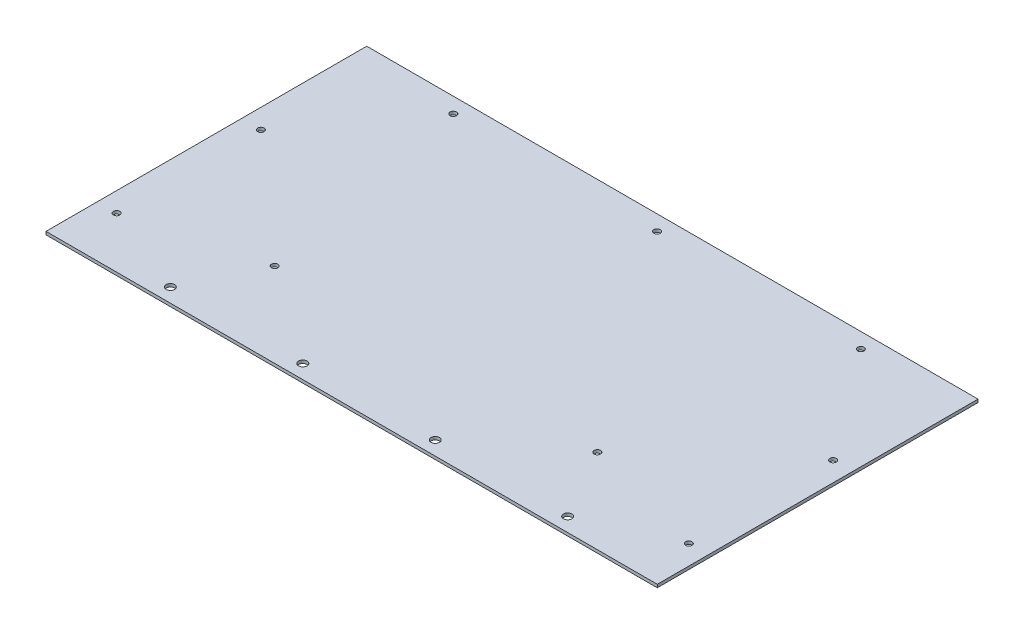
ISO-10303-21;
HEADER;
FILE_DESCRIPTION(('STEP AP214'),'2;1');
FILE_NAME('part.step','',(''),(''),'','','');
FILE_SCHEMA(('AUTOMOTIVE_DESIGN { 1 0 10303 214 1 1 1 1 }'));
ENDSEC;
DATA;
#1=APPLICATION_CONTEXT('core data for automotive mechanical design processes');
#2=APPLICATION_PROTOCOL_DEFINITION('international standard','automotive_design',2000,#1);
#3=PRODUCT_CONTEXT('',#1,'mechanical');
#4=PRODUCT('Part','Part','',(#3));
#5=PRODUCT_RELATED_PRODUCT_CATEGORY('part','',(#4));
#6=PRODUCT_DEFINITION_FORMATION('','',#4);
#7=PRODUCT_DEFINITION_CONTEXT('part definition',#1,'design');
#8=PRODUCT_DEFINITION('design','',#6,#7);
#9=PRODUCT_DEFINITION_SHAPE('','',#8);
#10=(LENGTH_UNIT() NAMED_UNIT(*) SI_UNIT(.MILLI.,.METRE.));
#11=(NAMED_UNIT(*) PLANE_ANGLE_UNIT() SI_UNIT($,.RADIAN.));
#12=(NAMED_UNIT(*) SI_UNIT($,.STERADIAN.) SOLID_ANGLE_UNIT());
#13=UNCERTAINTY_MEASURE_WITH_UNIT(LENGTH_MEASURE(1.E-05),#10,'distance_accuracy_value','');
#14=(GEOMETRIC_REPRESENTATION_CONTEXT(3) GLOBAL_UNCERTAINTY_ASSIGNED_CONTEXT((#13)) GLOBAL_UNIT_ASSIGNED_CONTEXT((#10,
#11,#12)) REPRESENTATION_CONTEXT('',''));
#15=CARTESIAN_POINT('',(0.,0.,0.));
#16=DIRECTION('',(0.,0.,1.));
#17=DIRECTION('',(1.,0.,0.));
#18=AXIS2_PLACEMENT_3D('',#15,#16,#17);
#19=CARTESIAN_POINT('',(151.1185,-1.397,229.425200026));
#20=DIRECTION('',(0.,1.,0.));
#21=DIRECTION('',(0.,0.,1.));
#22=AXIS2_PLACEMENT_3D('',#19,#20,#21);
#23=CYLINDRICAL_SURFACE('',#22,3.175);
#24=CARTESIAN_POINT('',(151.1185,1.143,229.425200026));
#25=DIRECTION('',(0.,1.,0.));
#26=DIRECTION('',(0.,0.,1.));
#27=AXIS2_PLACEMENT_3D('',#24,#25,#26);
#28=CIRCLE('',#27,3.175);
#29=CARTESIAN_POINT('',(151.1185,1.143,232.600200026));
#30=VERTEX_POINT('',#29);
#31=EDGE_CURVE('E46',#30,#30,#28,.T.);
#32=ORIENTED_EDGE('',*,*,#31,.T.);
#33=EDGE_LOOP('',(#32));
#34=FACE_BOUND('',#33,.T.);
#35=CARTESIAN_POINT('',(151.1185,-1.143,229.425200026));
#36=DIRECTION('',(0.,1.,0.));
#37=DIRECTION('',(0.,0.,1.));
#38=AXIS2_PLACEMENT_3D('',#35,#36,#37);
#39=CIRCLE('',#38,3.175);
#40=CARTESIAN_POINT('',(151.1185,-1.143,232.600200026));
#41=VERTEX_POINT('',#40);
#42=EDGE_CURVE('E11',#41,#41,#39,.T.);
#43=ORIENTED_EDGE('',*,*,#42,.F.);
#44=EDGE_LOOP('',(#43));
#45=FACE_BOUND('',#44,.T.);
#46=ADVANCED_FACE('F39',(#34,#45),#23,.F.);
#47=CARTESIAN_POINT('',(52.0585,-1.397,229.425200026));
#48=DIRECTION('',(0.,1.,0.));
#49=DIRECTION('',(0.,0.,1.));
#50=AXIS2_PLACEMENT_3D('',#47,#48,#49);
#51=CYLINDRICAL_SURFACE('',#50,3.175);
#52=CARTESIAN_POINT('',(52.0585,1.143,229.425200026));
#53=DIRECTION('',(0.,1.,0.));
#54=DIRECTION('',(0.,0.,1.));
#55=AXIS2_PLACEMENT_3D('',#52,#53,#54);
#56=CIRCLE('',#55,3.175);
#57=CARTESIAN_POINT('',(52.0585,1.143,232.600200026));
#58=VERTEX_POINT('',#57);
#59=EDGE_CURVE('E132',#58,#58,#56,.T.);
#60=ORIENTED_EDGE('',*,*,#59,.T.);
#61=EDGE_LOOP('',(#60));
#62=FACE_BOUND('',#61,.T.);
#63=CARTESIAN_POINT('',(52.0585,-1.143,229.425200026));
#64=DIRECTION('',(0.,1.,0.));
#65=DIRECTION('',(0.,0.,1.));
#66=AXIS2_PLACEMENT_3D('',#63,#64,#65);
#67=CIRCLE('',#66,3.175);
#68=CARTESIAN_POINT('',(52.0585,-1.143,232.600200026));
#69=VERTEX_POINT('',#68);
#70=EDGE_CURVE('E137',#69,#69,#67,.T.);
#71=ORIENTED_EDGE('',*,*,#70,.F.);
#72=EDGE_LOOP('',(#71));
#73=FACE_BOUND('',#72,.T.);
#74=ADVANCED_FACE('F156',(#62,#73),#51,.F.);
#75=CARTESIAN_POINT('',(228.6115,-1.143,238.315200026));
#76=DIRECTION('',(-1.,0.,0.));
#77=DIRECTION('',(0.,0.,1.));
#78=AXIS2_PLACEMENT_3D('',#75,#76,#77);
#79=PLANE('',#78);
#80=DIRECTION('',(0.,1.,0.));
#81=VECTOR('',#80,1.);
#82=CARTESIAN_POINT('',(228.6115,-1.143,0.));
#83=LINE('',#82,#81);
#84=CARTESIAN_POINT('',(228.6115,-1.143,0.));
#85=VERTEX_POINT('',#84);
#86=CARTESIAN_POINT('',(228.6115,1.143,0.));
#87=VERTEX_POINT('',#86);
#88=EDGE_CURVE('E122',#85,#87,#83,.T.);
#89=ORIENTED_EDGE('',*,*,#88,.T.);
#90=DIRECTION('',(0.,0.,-1.));
#91=VECTOR('',#90,1.);
#92=CARTESIAN_POINT('',(228.6115,1.143,238.315200026));
#93=LINE('',#92,#91);
#94=CARTESIAN_POINT('',(228.6115,1.143,239.902700026));
#95=VERTEX_POINT('',#94);
#96=EDGE_CURVE('E93',#95,#87,#93,.T.);
#97=ORIENTED_EDGE('',*,*,#96,.F.);
#98=DIRECTION('',(0.,1.,0.));
#99=VECTOR('',#98,1.);
#100=CARTESIAN_POINT('',(228.6115,-1.143,239.902700026));
#101=LINE('',#100,#99);
#102=CARTESIAN_POINT('',(228.6115,-1.143,239.902700026));
#103=VERTEX_POINT('',#102);
#104=EDGE_CURVE('E90',#103,#95,#101,.T.);
#105=ORIENTED_EDGE('',*,*,#104,.F.);
#106=DIRECTION('',(0.,0.,-1.));
#107=VECTOR('',#106,1.);
#108=CARTESIAN_POINT('',(228.6115,-1.143,238.315200026));
#109=LINE('',#108,#107);
#110=EDGE_CURVE('E78',#103,#85,#109,.T.);
#111=ORIENTED_EDGE('',*,*,#110,.T.);
#112=EDGE_LOOP('',(#89,#97,#105,#111));
#113=FACE_BOUND('',#112,.T.);
#114=ADVANCED_FACE('F91',(#113),#79,.F.);
#115=CARTESIAN_POINT('',(-228.6115,1.143,238.315200026));
#116=DIRECTION('',(0.,-1.,0.));
#117=DIRECTION('',(0.,0.,-1.));
#118=AXIS2_PLACEMENT_3D('',#115,#116,#117);
#119=PLANE('',#118);
#120=CARTESIAN_POINT('',(-214.0065,1.143,201.724823778392));
#121=DIRECTION('',(0.,-1.,0.));
#122=DIRECTION('',(0.,0.,-1.));
#123=AXIS2_PLACEMENT_3D('',#120,#121,#122);
#124=CIRCLE('',#123,2.39999999999999);
#125=CARTESIAN_POINT('',(-214.0065,1.143,199.324823778392));
#126=VERTEX_POINT('',#125);
#127=EDGE_CURVE('E231',#126,#126,#124,.T.);
#128=ORIENTED_EDGE('',*,*,#127,.T.);
#129=EDGE_LOOP('',(#128));
#130=FACE_BOUND('',#129,.T.);
#131=CARTESIAN_POINT('',(-214.0065,1.143,93.7748237783918));
#132=DIRECTION('',(0.,-1.,0.));
#133=DIRECTION('',(0.,0.,-1.));
#134=AXIS2_PLACEMENT_3D('',#131,#132,#133);
#135=CIRCLE('',#134,2.39999999999999);
#136=CARTESIAN_POINT('',(-214.0065,1.143,91.3748237783918));
#137=VERTEX_POINT('',#136);
#138=EDGE_CURVE('E240',#137,#137,#135,.T.);
#139=ORIENTED_EDGE('',*,*,#138,.T.);
#140=EDGE_LOOP('',(#139));
#141=FACE_BOUND('',#140,.T.);
#142=CARTESIAN_POINT('',(-152.399999999999,1.143,11.43));
#143=DIRECTION('',(0.,-1.,0.));
#144=DIRECTION('',(0.,0.,-1.));
#145=AXIS2_PLACEMENT_3D('',#142,#143,#144);
#146=CIRCLE('',#145,2.39999999999999);
#147=CARTESIAN_POINT('',(-152.399999999999,1.143,9.03000000000002));
#148=VERTEX_POINT('',#147);
#149=EDGE_CURVE('E246',#148,#148,#146,.T.);
#150=ORIENTED_EDGE('',*,*,#149,.T.);
#151=EDGE_LOOP('',(#150));
#152=FACE_BOUND('',#151,.T.);
#153=CARTESIAN_POINT('',(1.45784238087221E-12,1.143,11.43));
#154=DIRECTION('',(0.,-1.,0.));
#155=DIRECTION('',(0.,0.,-1.));
#156=AXIS2_PLACEMENT_3D('',#153,#154,#155);
#157=CIRCLE('',#156,2.39999999999999);
#158=CARTESIAN_POINT('',(1.45784238087221E-12,1.143,9.03000000000001));
#159=VERTEX_POINT('',#158);
#160=EDGE_CURVE('E252',#159,#159,#157,.T.);
#161=ORIENTED_EDGE('',*,*,#160,.T.);
#162=EDGE_LOOP('',(#161));
#163=FACE_BOUND('',#162,.T.);
#164=CARTESIAN_POINT('',(152.400000000001,1.143,11.43));
#165=DIRECTION('',(0.,-1.,0.));
#166=DIRECTION('',(0.,0.,-1.));
#167=AXIS2_PLACEMENT_3D('',#164,#165,#166);
#168=CIRCLE('',#167,2.39999999999999);
#169=CARTESIAN_POINT('',(152.400000000001,1.143,9.03000000000002));
#170=VERTEX_POINT('',#169);
#171=EDGE_CURVE('E258',#170,#170,#168,.T.);
#172=ORIENTED_EDGE('',*,*,#171,.T.);
#173=EDGE_LOOP('',(#172));
#174=FACE_BOUND('',#173,.T.);
#175=CARTESIAN_POINT('',(214.0065,1.143,93.7748237783918));
#176=DIRECTION('',(0.,-1.,0.));
#177=DIRECTION('',(0.,0.,-1.));
#178=AXIS2_PLACEMENT_3D('',#175,#176,#177);
#179=CIRCLE('',#178,2.39999999999999);
#180=CARTESIAN_POINT('',(214.0065,1.143,91.3748237783918));
#181=VERTEX_POINT('',#180);
#182=EDGE_CURVE('E264',#181,#181,#179,.T.);
#183=ORIENTED_EDGE('',*,*,#182,.T.);
#184=EDGE_LOOP('',(#183));
#185=FACE_BOUND('',#184,.T.);
#186=CARTESIAN_POINT('',(214.0065,1.143,201.724823778392));
#187=DIRECTION('',(0.,-1.,0.));
#188=DIRECTION('',(0.,0.,-1.));
#189=AXIS2_PLACEMENT_3D('',#186,#187,#188);
#190=CIRCLE('',#189,2.39999999999999);
#191=CARTESIAN_POINT('',(214.0065,1.143,199.324823778392));
#192=VERTEX_POINT('',#191);
#193=EDGE_CURVE('E270',#192,#192,#190,.T.);
#194=ORIENTED_EDGE('',*,*,#193,.T.);
#195=EDGE_LOOP('',(#194));
#196=FACE_BOUND('',#195,.T.);
#197=CARTESIAN_POINT('',(120.65,1.143,176.776));
#198=DIRECTION('',(0.,-1.,0.));
#199=DIRECTION('',(0.,0.,-1.));
#200=AXIS2_PLACEMENT_3D('',#197,#198,#199);
#201=CIRCLE('',#200,2.4);
#202=CARTESIAN_POINT('',(120.65,1.143,174.376));
#203=VERTEX_POINT('',#202);
#204=EDGE_CURVE('E276',#203,#203,#201,.T.);
#205=ORIENTED_EDGE('',*,*,#204,.T.);
#206=EDGE_LOOP('',(#205));
#207=FACE_BOUND('',#206,.T.);
#208=CARTESIAN_POINT('',(-120.65,1.143,176.776));
#209=DIRECTION('',(0.,-1.,0.));
#210=DIRECTION('',(0.,0.,-1.));
#211=AXIS2_PLACEMENT_3D('',#208,#209,#210);
#212=CIRCLE('',#211,2.4);
#213=CARTESIAN_POINT('',(-120.65,1.143,174.376));
#214=VERTEX_POINT('',#213);
#215=EDGE_CURVE('E103',#214,#214,#212,.T.);
#216=ORIENTED_EDGE('',*,*,#215,.T.);
#217=EDGE_LOOP('',(#216));
#218=FACE_BOUND('',#217,.T.);
#219=CARTESIAN_POINT('',(-47.0015,1.143,229.425200026));
#220=DIRECTION('',(0.,1.,0.));
#221=DIRECTION('',(0.,0.,1.));
#222=AXIS2_PLACEMENT_3D('',#219,#220,#221);
#223=CIRCLE('',#222,3.175);
#224=CARTESIAN_POINT('',(-47.0015,1.143,232.600200026));
#225=VERTEX_POINT('',#224);
#226=EDGE_CURVE('E112',#225,#225,#223,.T.);
#227=ORIENTED_EDGE('',*,*,#226,.F.);
#228=EDGE_LOOP('',(#227));
#229=FACE_BOUND('',#228,.T.);
#230=CARTESIAN_POINT('',(-146.0615,1.143,229.425200026));
#231=DIRECTION('',(0.,1.,0.));
#232=DIRECTION('',(0.,0.,1.));
#233=AXIS2_PLACEMENT_3D('',#230,#231,#232);
#234=CIRCLE('',#233,3.175);
#235=CARTESIAN_POINT('',(-146.0615,1.143,232.600200026));
#236=VERTEX_POINT('',#235);
#237=EDGE_CURVE('E118',#236,#236,#234,.T.);
#238=ORIENTED_EDGE('',*,*,#237,.F.);
#239=EDGE_LOOP('',(#238));
#240=FACE_BOUND('',#239,.T.);
#241=DIRECTION('',(-1.,0.,0.));
#242=VECTOR('',#241,1.);
#243=CARTESIAN_POINT('',(-228.6115,1.143,0.));
#244=LINE('',#243,#242);
#245=CARTESIAN_POINT('',(-228.6115,1.143,0.));
#246=VERTEX_POINT('',#245);
#247=EDGE_CURVE('E124',#87,#246,#244,.T.);
#248=ORIENTED_EDGE('',*,*,#247,.T.);
#249=DIRECTION('',(0.,0.,-1.));
#250=VECTOR('',#249,1.);
#251=CARTESIAN_POINT('',(-228.6115,1.143,238.315200026));
#252=LINE('',#251,#250);
#253=CARTESIAN_POINT('',(-228.6115,1.143,239.902700026));
#254=VERTEX_POINT('',#253);
#255=EDGE_CURVE('E129',#254,#246,#252,.T.);
#256=ORIENTED_EDGE('',*,*,#255,.F.);
#257=DIRECTION('',(-1.,0.,0.));
#258=VECTOR('',#257,1.);
#259=CARTESIAN_POINT('',(228.6115,1.143,239.902700026));
#260=LINE('',#259,#258);
#261=EDGE_CURVE('E97',#95,#254,#260,.T.);
#262=ORIENTED_EDGE('',*,*,#261,.F.);
#263=ORIENTED_EDGE('',*,*,#96,.T.);
#264=EDGE_LOOP('',(#248,#256,#262,#263));
#265=FACE_BOUND('',#264,.T.);
#266=ORIENTED_EDGE('',*,*,#59,.F.);
#267=EDGE_LOOP('',(#266));
#268=FACE_BOUND('',#267,.T.);
#269=ORIENTED_EDGE('',*,*,#31,.F.);
#270=EDGE_LOOP('',(#269));
#271=FACE_BOUND('',#270,.T.);
#272=ADVANCED_FACE('F144',(#130,#141,#152,#163,#174,#185,#196,#207,#218,#229,#240,#265,#268,
#271),#119,.F.);
#273=CARTESIAN_POINT('',(-228.6115,-1.143,238.315200026));
#274=DIRECTION('',(1.,0.,0.));
#275=DIRECTION('',(0.,0.,-1.));
#276=AXIS2_PLACEMENT_3D('',#273,#274,#275);
#277=PLANE('',#276);
#278=DIRECTION('',(0.,-1.,0.));
#279=VECTOR('',#278,1.);
#280=CARTESIAN_POINT('',(-228.6115,-1.143,0.));
#281=LINE('',#280,#279);
#282=CARTESIAN_POINT('',(-228.6115,-1.143,0.));
#283=VERTEX_POINT('',#282);
#284=EDGE_CURVE('E61',#246,#283,#281,.T.);
#285=ORIENTED_EDGE('',*,*,#284,.T.);
#286=DIRECTION('',(0.,0.,-1.));
#287=VECTOR('',#286,1.);
#288=CARTESIAN_POINT('',(-228.6115,-1.143,238.315200026));
#289=LINE('',#288,#287);
#290=CARTESIAN_POINT('',(-228.6115,-1.143,239.902700026));
#291=VERTEX_POINT('',#290);
#292=EDGE_CURVE('E87',#291,#283,#289,.T.);
#293=ORIENTED_EDGE('',*,*,#292,.F.);
#294=DIRECTION('',(0.,-1.,0.));
#295=VECTOR('',#294,1.);
#296=CARTESIAN_POINT('',(-228.6115,1.143,239.902700026));
#297=LINE('',#296,#295);
#298=EDGE_CURVE('E102',#254,#291,#297,.T.);
#299=ORIENTED_EDGE('',*,*,#298,.F.);
#300=ORIENTED_EDGE('',*,*,#255,.T.);
#301=EDGE_LOOP('',(#285,#293,#299,#300));
#302=FACE_BOUND('',#301,.T.);
#303=ADVANCED_FACE('F146',(#302),#277,.F.);
#304=CARTESIAN_POINT('',(-228.6115,-1.143,238.315200026));
#305=DIRECTION('',(0.,1.,0.));
#306=DIRECTION('',(0.,0.,1.));
#307=AXIS2_PLACEMENT_3D('',#304,#305,#306);
#308=PLANE('',#307);
#309=CARTESIAN_POINT('',(-214.0065,-1.143,201.724823778392));
#310=DIRECTION('',(0.,-1.,0.));
#311=DIRECTION('',(0.,0.,-1.));
#312=AXIS2_PLACEMENT_3D('',#309,#310,#311);
#313=CIRCLE('',#312,2.39999999999999);
#314=CARTESIAN_POINT('',(-214.0065,-1.143,199.324823778392));
#315=VERTEX_POINT('',#314);
#316=EDGE_CURVE('E233',#315,#315,#313,.T.);
#317=ORIENTED_EDGE('',*,*,#316,.F.);
#318=EDGE_LOOP('',(#317));
#319=FACE_BOUND('',#318,.T.);
#320=CARTESIAN_POINT('',(-214.0065,-1.143,93.7748237783918));
#321=DIRECTION('',(0.,-1.,0.));
#322=DIRECTION('',(0.,0.,-1.));
#323=AXIS2_PLACEMENT_3D('',#320,#321,#322);
#324=CIRCLE('',#323,2.39999999999999);
#325=CARTESIAN_POINT('',(-214.0065,-1.143,91.3748237783918));
#326=VERTEX_POINT('',#325);
#327=EDGE_CURVE('E235',#326,#326,#324,.T.);
#328=ORIENTED_EDGE('',*,*,#327,.F.);
#329=EDGE_LOOP('',(#328));
#330=FACE_BOUND('',#329,.T.);
#331=CARTESIAN_POINT('',(-152.399999999999,-1.143,11.43));
#332=DIRECTION('',(0.,-1.,0.));
#333=DIRECTION('',(0.,0.,-1.));
#334=AXIS2_PLACEMENT_3D('',#331,#332,#333);
#335=CIRCLE('',#334,2.39999999999999);
#336=CARTESIAN_POINT('',(-152.399999999999,-1.143,9.03000000000002));
#337=VERTEX_POINT('',#336);
#338=EDGE_CURVE('E243',#337,#337,#335,.T.);
#339=ORIENTED_EDGE('',*,*,#338,.F.);
#340=EDGE_LOOP('',(#339));
#341=FACE_BOUND('',#340,.T.);
#342=CARTESIAN_POINT('',(1.45784238087221E-12,-1.143,11.43));
#343=DIRECTION('',(0.,-1.,0.));
#344=DIRECTION('',(0.,0.,-1.));
#345=AXIS2_PLACEMENT_3D('',#342,#343,#344);
#346=CIRCLE('',#345,2.39999999999999);
#347=CARTESIAN_POINT('',(1.45784238087221E-12,-1.143,9.03000000000002));
#348=VERTEX_POINT('',#347);
#349=EDGE_CURVE('E249',#348,#348,#346,.T.);
#350=ORIENTED_EDGE('',*,*,#349,.F.);
#351=EDGE_LOOP('',(#350));
#352=FACE_BOUND('',#351,.T.);
#353=CARTESIAN_POINT('',(152.400000000001,-1.143,11.43));
#354=DIRECTION('',(0.,-1.,0.));
#355=DIRECTION('',(0.,0.,-1.));
#356=AXIS2_PLACEMENT_3D('',#353,#354,#355);
#357=CIRCLE('',#356,2.39999999999999);
#358=CARTESIAN_POINT('',(152.400000000001,-1.143,9.03000000000002));
#359=VERTEX_POINT('',#358);
#360=EDGE_CURVE('E255',#359,#359,#357,.T.);
#361=ORIENTED_EDGE('',*,*,#360,.F.);
#362=EDGE_LOOP('',(#361));
#363=FACE_BOUND('',#362,.T.);
#364=CARTESIAN_POINT('',(214.0065,-1.143,93.7748237783918));
#365=DIRECTION('',(0.,-1.,0.));
#366=DIRECTION('',(0.,0.,-1.));
#367=AXIS2_PLACEMENT_3D('',#364,#365,#366);
#368=CIRCLE('',#367,2.39999999999999);
#369=CARTESIAN_POINT('',(214.0065,-1.143,91.3748237783918));
#370=VERTEX_POINT('',#369);
#371=EDGE_CURVE('E261',#370,#370,#368,.T.);
#372=ORIENTED_EDGE('',*,*,#371,.F.);
#373=EDGE_LOOP('',(#372));
#374=FACE_BOUND('',#373,.T.);
#375=CARTESIAN_POINT('',(214.0065,-1.143,201.724823778392));
#376=DIRECTION('',(0.,-1.,0.));
#377=DIRECTION('',(0.,0.,-1.));
#378=AXIS2_PLACEMENT_3D('',#375,#376,#377);
#379=CIRCLE('',#378,2.39999999999999);
#380=CARTESIAN_POINT('',(214.0065,-1.143,199.324823778392));
#381=VERTEX_POINT('',#380);
#382=EDGE_CURVE('E267',#381,#381,#379,.T.);
#383=ORIENTED_EDGE('',*,*,#382,.F.);
#384=EDGE_LOOP('',(#383));
#385=FACE_BOUND('',#384,.T.);
#386=CARTESIAN_POINT('',(120.65,-1.143,176.776));
#387=DIRECTION('',(0.,-1.,0.));
#388=DIRECTION('',(0.,0.,-1.));
#389=AXIS2_PLACEMENT_3D('',#386,#387,#388);
#390=CIRCLE('',#389,2.39999999999999);
#391=CARTESIAN_POINT('',(120.65,-1.143,174.376));
#392=VERTEX_POINT('',#391);
#393=EDGE_CURVE('E273',#392,#392,#390,.T.);
#394=ORIENTED_EDGE('',*,*,#393,.F.);
#395=EDGE_LOOP('',(#394));
#396=FACE_BOUND('',#395,.T.);
#397=CARTESIAN_POINT('',(-120.65,-1.143,176.776));
#398=DIRECTION('',(0.,-1.,0.));
#399=DIRECTION('',(0.,0.,-1.));
#400=AXIS2_PLACEMENT_3D('',#397,#398,#399);
#401=CIRCLE('',#400,2.39999999999999);
#402=CARTESIAN_POINT('',(-120.65,-1.143,174.376));
#403=VERTEX_POINT('',#402);
#404=EDGE_CURVE('E106',#403,#403,#401,.T.);
#405=ORIENTED_EDGE('',*,*,#404,.F.);
#406=EDGE_LOOP('',(#405));
#407=FACE_BOUND('',#406,.T.);
#408=CARTESIAN_POINT('',(-47.0015,-1.143,229.425200026));
#409=DIRECTION('',(0.,1.,0.));
#410=DIRECTION('',(0.,0.,1.));
#411=AXIS2_PLACEMENT_3D('',#408,#409,#410);
#412=CIRCLE('',#411,3.175);
#413=CARTESIAN_POINT('',(-47.0015,-1.143,232.600200026));
#414=VERTEX_POINT('',#413);
#415=EDGE_CURVE('E115',#414,#414,#412,.T.);
#416=ORIENTED_EDGE('',*,*,#415,.T.);
#417=EDGE_LOOP('',(#416));
#418=FACE_BOUND('',#417,.T.);
#419=CARTESIAN_POINT('',(-146.0615,-1.143,229.425200026));
#420=DIRECTION('',(0.,1.,0.));
#421=DIRECTION('',(0.,0.,1.));
#422=AXIS2_PLACEMENT_3D('',#419,#420,#421);
#423=CIRCLE('',#422,3.175);
#424=CARTESIAN_POINT('',(-146.0615,-1.143,232.600200026));
#425=VERTEX_POINT('',#424);
#426=EDGE_CURVE('E121',#425,#425,#423,.T.);
#427=ORIENTED_EDGE('',*,*,#426,.T.);
#428=EDGE_LOOP('',(#427));
#429=FACE_BOUND('',#428,.T.);
#430=DIRECTION('',(1.,0.,0.));
#431=VECTOR('',#430,1.);
#432=CARTESIAN_POINT('',(-228.6115,-1.143,0.));
#433=LINE('',#432,#431);
#434=EDGE_CURVE('E53',#283,#85,#433,.T.);
#435=ORIENTED_EDGE('',*,*,#434,.T.);
#436=ORIENTED_EDGE('',*,*,#110,.F.);
#437=DIRECTION('',(1.,0.,0.));
#438=VECTOR('',#437,1.);
#439=CARTESIAN_POINT('',(-228.6115,-1.143,239.902700026));
#440=LINE('',#439,#438);
#441=EDGE_CURVE('E83',#291,#103,#440,.T.);
#442=ORIENTED_EDGE('',*,*,#441,.F.);
#443=ORIENTED_EDGE('',*,*,#292,.T.);
#444=EDGE_LOOP('',(#435,#436,#442,#443));
#445=FACE_BOUND('',#444,.T.);
#446=ORIENTED_EDGE('',*,*,#70,.T.);
#447=EDGE_LOOP('',(#446));
#448=FACE_BOUND('',#447,.T.);
#449=ORIENTED_EDGE('',*,*,#42,.T.);
#450=EDGE_LOOP('',(#449));
#451=FACE_BOUND('',#450,.T.);
#452=ADVANCED_FACE('F80',(#319,#330,#341,#352,#363,#374,#385,#396,#407,#418,#429,#445,#448,
#451),#308,.F.);
#453=CARTESIAN_POINT('',(0.,0.,0.));
#454=DIRECTION('',(0.,0.,-1.));
#455=DIRECTION('',(-1.,0.,0.));
#456=AXIS2_PLACEMENT_3D('',#453,#454,#455);
#457=PLANE('',#456);
#458=ORIENTED_EDGE('',*,*,#88,.F.);
#459=ORIENTED_EDGE('',*,*,#434,.F.);
#460=ORIENTED_EDGE('',*,*,#284,.F.);
#461=ORIENTED_EDGE('',*,*,#247,.F.);
#462=EDGE_LOOP('',(#458,#459,#460,#461));
#463=FACE_BOUND('',#462,.T.);
#464=ADVANCED_FACE('F173',(#463),#457,.T.);
#465=CARTESIAN_POINT('',(-146.0615,-1.397,229.425200026));
#466=DIRECTION('',(0.,1.,0.));
#467=DIRECTION('',(0.,0.,1.));
#468=AXIS2_PLACEMENT_3D('',#465,#466,#467);
#469=CYLINDRICAL_SURFACE('',#468,3.175);
#470=ORIENTED_EDGE('',*,*,#237,.T.);
#471=EDGE_LOOP('',(#470));
#472=FACE_BOUND('',#471,.T.);
#473=ORIENTED_EDGE('',*,*,#426,.F.);
#474=EDGE_LOOP('',(#473));
#475=FACE_BOUND('',#474,.T.);
#476=ADVANCED_FACE('F181',(#472,#475),#469,.F.);
#477=CARTESIAN_POINT('',(-47.0015,-1.397,229.425200026));
#478=DIRECTION('',(0.,1.,0.));
#479=DIRECTION('',(0.,0.,1.));
#480=AXIS2_PLACEMENT_3D('',#477,#478,#479);
#481=CYLINDRICAL_SURFACE('',#480,3.175);
#482=ORIENTED_EDGE('',*,*,#226,.T.);
#483=EDGE_LOOP('',(#482));
#484=FACE_BOUND('',#483,.T.);
#485=ORIENTED_EDGE('',*,*,#415,.F.);
#486=EDGE_LOOP('',(#485));
#487=FACE_BOUND('',#486,.T.);
#488=ADVANCED_FACE('F188',(#484,#487),#481,.F.);
#489=CARTESIAN_POINT('',(0.,0.,239.902700026));
#490=DIRECTION('',(0.,0.,1.));
#491=DIRECTION('',(1.,0.,0.));
#492=AXIS2_PLACEMENT_3D('',#489,#490,#491);
#493=PLANE('',#492);
#494=ORIENTED_EDGE('',*,*,#441,.T.);
#495=ORIENTED_EDGE('',*,*,#104,.T.);
#496=ORIENTED_EDGE('',*,*,#261,.T.);
#497=ORIENTED_EDGE('',*,*,#298,.T.);
#498=EDGE_LOOP('',(#494,#495,#496,#497));
#499=FACE_BOUND('',#498,.T.);
#500=ADVANCED_FACE('F100',(#499),#493,.T.);
#501=CARTESIAN_POINT('',(-120.65,-1.143,176.776));
#502=DIRECTION('',(0.,-1.,0.));
#503=DIRECTION('',(0.,0.,-1.));
#504=AXIS2_PLACEMENT_3D('',#501,#502,#503);
#505=CYLINDRICAL_SURFACE('',#504,2.39999999999999);
#506=ORIENTED_EDGE('',*,*,#215,.F.);
#507=EDGE_LOOP('',(#506));
#508=FACE_BOUND('',#507,.T.);
#509=ORIENTED_EDGE('',*,*,#404,.T.);
#510=EDGE_LOOP('',(#509));
#511=FACE_BOUND('',#510,.T.);
#512=ADVANCED_FACE('F193',(#508,#511),#505,.F.);
#513=CARTESIAN_POINT('',(120.65,-1.143,176.776));
#514=DIRECTION('',(0.,-1.,0.));
#515=DIRECTION('',(0.,0.,-1.));
#516=AXIS2_PLACEMENT_3D('',#513,#514,#515);
#517=CYLINDRICAL_SURFACE('',#516,2.39999999999999);
#518=ORIENTED_EDGE('',*,*,#204,.F.);
#519=EDGE_LOOP('',(#518));
#520=FACE_BOUND('',#519,.T.);
#521=ORIENTED_EDGE('',*,*,#393,.T.);
#522=EDGE_LOOP('',(#521));
#523=FACE_BOUND('',#522,.T.);
#524=ADVANCED_FACE('F195',(#520,#523),#517,.F.);
#525=CARTESIAN_POINT('',(214.0065,-1.143,201.724823778392));
#526=DIRECTION('',(0.,-1.,0.));
#527=DIRECTION('',(0.,0.,-1.));
#528=AXIS2_PLACEMENT_3D('',#525,#526,#527);
#529=CYLINDRICAL_SURFACE('',#528,2.39999999999999);
#530=ORIENTED_EDGE('',*,*,#193,.F.);
#531=EDGE_LOOP('',(#530));
#532=FACE_BOUND('',#531,.T.);
#533=ORIENTED_EDGE('',*,*,#382,.T.);
#534=EDGE_LOOP('',(#533));
#535=FACE_BOUND('',#534,.T.);
#536=ADVANCED_FACE('F199',(#532,#535),#529,.F.);
#537=CARTESIAN_POINT('',(214.0065,-1.143,93.7748237783918));
#538=DIRECTION('',(0.,-1.,0.));
#539=DIRECTION('',(0.,0.,-1.));
#540=AXIS2_PLACEMENT_3D('',#537,#538,#539);
#541=CYLINDRICAL_SURFACE('',#540,2.39999999999999);
#542=ORIENTED_EDGE('',*,*,#182,.F.);
#543=EDGE_LOOP('',(#542));
#544=FACE_BOUND('',#543,.T.);
#545=ORIENTED_EDGE('',*,*,#371,.T.);
#546=EDGE_LOOP('',(#545));
#547=FACE_BOUND('',#546,.T.);
#548=ADVANCED_FACE('F203',(#544,#547),#541,.F.);
#549=CARTESIAN_POINT('',(152.400000000001,-1.143,11.43));
#550=DIRECTION('',(0.,-1.,0.));
#551=DIRECTION('',(0.,0.,-1.));
#552=AXIS2_PLACEMENT_3D('',#549,#550,#551);
#553=CYLINDRICAL_SURFACE('',#552,2.39999999999999);
#554=ORIENTED_EDGE('',*,*,#171,.F.);
#555=EDGE_LOOP('',(#554));
#556=FACE_BOUND('',#555,.T.);
#557=ORIENTED_EDGE('',*,*,#360,.T.);
#558=EDGE_LOOP('',(#557));
#559=FACE_BOUND('',#558,.T.);
#560=ADVANCED_FACE('F207',(#556,#559),#553,.F.);
#561=CARTESIAN_POINT('',(1.45784238087221E-12,-1.143,11.43));
#562=DIRECTION('',(0.,-1.,0.));
#563=DIRECTION('',(0.,0.,-1.));
#564=AXIS2_PLACEMENT_3D('',#561,#562,#563);
#565=CYLINDRICAL_SURFACE('',#564,2.39999999999999);
#566=ORIENTED_EDGE('',*,*,#160,.F.);
#567=EDGE_LOOP('',(#566));
#568=FACE_BOUND('',#567,.T.);
#569=ORIENTED_EDGE('',*,*,#349,.T.);
#570=EDGE_LOOP('',(#569));
#571=FACE_BOUND('',#570,.T.);
#572=ADVANCED_FACE('F211',(#568,#571),#565,.F.);
#573=CARTESIAN_POINT('',(-152.399999999999,-1.143,11.43));
#574=DIRECTION('',(0.,-1.,0.));
#575=DIRECTION('',(0.,0.,-1.));
#576=AXIS2_PLACEMENT_3D('',#573,#574,#575);
#577=CYLINDRICAL_SURFACE('',#576,2.39999999999999);
#578=ORIENTED_EDGE('',*,*,#149,.F.);
#579=EDGE_LOOP('',(#578));
#580=FACE_BOUND('',#579,.T.);
#581=ORIENTED_EDGE('',*,*,#338,.T.);
#582=EDGE_LOOP('',(#581));
#583=FACE_BOUND('',#582,.T.);
#584=ADVANCED_FACE('F215',(#580,#583),#577,.F.);
#585=CARTESIAN_POINT('',(-214.0065,-1.143,93.7748237783918));
#586=DIRECTION('',(0.,-1.,0.));
#587=DIRECTION('',(0.,0.,-1.));
#588=AXIS2_PLACEMENT_3D('',#585,#586,#587);
#589=CYLINDRICAL_SURFACE('',#588,2.39999999999999);
#590=ORIENTED_EDGE('',*,*,#138,.F.);
#591=EDGE_LOOP('',(#590));
#592=FACE_BOUND('',#591,.T.);
#593=ORIENTED_EDGE('',*,*,#327,.T.);
#594=EDGE_LOOP('',(#593));
#595=FACE_BOUND('',#594,.T.);
#596=ADVANCED_FACE('F219',(#592,#595),#589,.F.);
#597=CARTESIAN_POINT('',(-214.0065,-1.143,201.724823778392));
#598=DIRECTION('',(0.,-1.,0.));
#599=DIRECTION('',(0.,0.,-1.));
#600=AXIS2_PLACEMENT_3D('',#597,#598,#599);
#601=CYLINDRICAL_SURFACE('',#600,2.39999999999999);
#602=ORIENTED_EDGE('',*,*,#127,.F.);
#603=EDGE_LOOP('',(#602));
#604=FACE_BOUND('',#603,.T.);
#605=ORIENTED_EDGE('',*,*,#316,.T.);
#606=EDGE_LOOP('',(#605));
#607=FACE_BOUND('',#606,.T.);
#608=ADVANCED_FACE('F223',(#604,#607),#601,.F.);
#609=CLOSED_SHELL('',(#46,#74,#114,#272,#303,#452,#464,#476,#488,#500,#512,#524,#536,#548,#560,
#572,#584,#596,#608));
#610=MANIFOLD_SOLID_BREP('B2',#609);
#611=ADVANCED_BREP_SHAPE_REPRESENTATION('',(#18,#610),#14);
#612=SHAPE_DEFINITION_REPRESENTATION(#9,#611);
ENDSEC;
END-ISO-10303-21;
